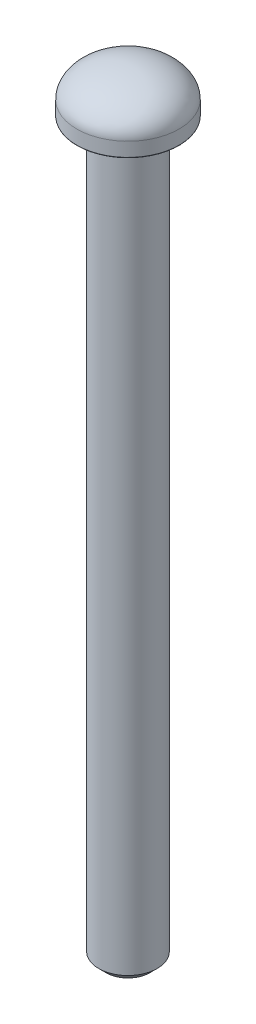
ISO-10303-21;
HEADER;
FILE_DESCRIPTION(('STEP AP214'),'2;1');
FILE_NAME('part.step','',(''),(''),'','','');
FILE_SCHEMA(('AUTOMOTIVE_DESIGN { 1 0 10303 214 1 1 1 1 }'));
ENDSEC;
DATA;
#1=APPLICATION_CONTEXT('core data for automotive mechanical design processes');
#2=APPLICATION_PROTOCOL_DEFINITION('international standard','automotive_design',2000,#1);
#3=PRODUCT_CONTEXT('',#1,'mechanical');
#4=PRODUCT('Part','Part','',(#3));
#5=PRODUCT_RELATED_PRODUCT_CATEGORY('part','',(#4));
#6=PRODUCT_DEFINITION_FORMATION('','',#4);
#7=PRODUCT_DEFINITION_CONTEXT('part definition',#1,'design');
#8=PRODUCT_DEFINITION('design','',#6,#7);
#9=PRODUCT_DEFINITION_SHAPE('','',#8);
#10=(LENGTH_UNIT() NAMED_UNIT(*) SI_UNIT(.MILLI.,.METRE.));
#11=(NAMED_UNIT(*) PLANE_ANGLE_UNIT() SI_UNIT($,.RADIAN.));
#12=(NAMED_UNIT(*) SI_UNIT($,.STERADIAN.) SOLID_ANGLE_UNIT());
#13=UNCERTAINTY_MEASURE_WITH_UNIT(LENGTH_MEASURE(1.E-05),#10,'distance_accuracy_value','');
#14=(GEOMETRIC_REPRESENTATION_CONTEXT(3) GLOBAL_UNCERTAINTY_ASSIGNED_CONTEXT((#13)) GLOBAL_UNIT_ASSIGNED_CONTEXT((#10,
#11,#12)) REPRESENTATION_CONTEXT('',''));
#15=CARTESIAN_POINT('',(0.,0.,0.));
#16=DIRECTION('',(0.,0.,1.));
#17=DIRECTION('',(1.,0.,0.));
#18=AXIS2_PLACEMENT_3D('',#15,#16,#17);
#19=CARTESIAN_POINT('',(0.,100.,0.));
#20=DIRECTION('',(0.,-1.,0.));
#21=DIRECTION('',(0.,0.,-1.));
#22=AXIS2_PLACEMENT_3D('',#19,#20,#21);
#23=CYLINDRICAL_SURFACE('',#22,4.);
#24=CARTESIAN_POINT('',(0.,1.,0.));
#25=DIRECTION('',(0.,1.,0.));
#26=DIRECTION('',(0.,0.,1.));
#27=AXIS2_PLACEMENT_3D('',#24,#25,#26);
#28=CIRCLE('',#27,4.);
#29=CARTESIAN_POINT('',(0.,1.,4.));
#30=VERTEX_POINT('',#29);
#31=EDGE_CURVE('E39',#30,#30,#28,.T.);
#32=ORIENTED_EDGE('',*,*,#31,.T.);
#33=EDGE_LOOP('',(#32));
#34=FACE_BOUND('',#33,.T.);
#35=CARTESIAN_POINT('',(0.,99.9,0.));
#36=DIRECTION('',(0.,1.,0.));
#37=DIRECTION('',(0.,0.,1.));
#38=AXIS2_PLACEMENT_3D('',#35,#36,#37);
#39=CIRCLE('',#38,4.);
#40=CARTESIAN_POINT('',(0.,99.9,4.));
#41=VERTEX_POINT('',#40);
#42=EDGE_CURVE('E86',#41,#41,#39,.F.);
#43=ORIENTED_EDGE('',*,*,#42,.T.);
#44=EDGE_LOOP('',(#43));
#45=FACE_BOUND('',#44,.T.);
#46=ADVANCED_FACE('F32',(#34,#45),#23,.T.);
#47=CARTESIAN_POINT('',(0.,0.,0.));
#48=DIRECTION('',(0.,1.,0.));
#49=DIRECTION('',(0.,0.,1.));
#50=AXIS2_PLACEMENT_3D('',#47,#48,#49);
#51=PLANE('',#50);
#52=CARTESIAN_POINT('',(0.,0.,0.));
#53=DIRECTION('',(0.,1.,0.));
#54=DIRECTION('',(0.,0.,1.));
#55=AXIS2_PLACEMENT_3D('',#52,#53,#54);
#56=CIRCLE('',#55,3.);
#57=CARTESIAN_POINT('',(0.,0.,3.));
#58=VERTEX_POINT('',#57);
#59=EDGE_CURVE('E11',#58,#58,#56,.F.);
#60=ORIENTED_EDGE('',*,*,#59,.T.);
#61=EDGE_LOOP('',(#60));
#62=FACE_BOUND('',#61,.T.);
#63=ADVANCED_FACE('F76',(#62),#51,.F.);
#64=CARTESIAN_POINT('',(0.,102.,0.));
#65=DIRECTION('',(0.,-1.,0.));
#66=DIRECTION('',(0.,0.,-1.));
#67=AXIS2_PLACEMENT_3D('',#64,#65,#66);
#68=CYLINDRICAL_SURFACE('',#67,7.);
#69=CARTESIAN_POINT('',(0.,100.1,0.));
#70=DIRECTION('',(0.,1.,0.));
#71=DIRECTION('',(0.,0.,1.));
#72=AXIS2_PLACEMENT_3D('',#69,#70,#71);
#73=CIRCLE('',#72,7.);
#74=CARTESIAN_POINT('',(0.,100.1,7.));
#75=VERTEX_POINT('',#74);
#76=EDGE_CURVE('E52',#75,#75,#73,.T.);
#77=ORIENTED_EDGE('',*,*,#76,.T.);
#78=EDGE_LOOP('',(#77));
#79=FACE_BOUND('',#78,.T.);
#80=CARTESIAN_POINT('',(0.,102.,0.));
#81=DIRECTION('',(0.,1.,0.));
#82=DIRECTION('',(0.,0.,1.));
#83=AXIS2_PLACEMENT_3D('',#80,#81,#82);
#84=CIRCLE('',#83,7.);
#85=CARTESIAN_POINT('',(0.,102.,7.));
#86=VERTEX_POINT('',#85);
#87=EDGE_CURVE('E50',#86,#86,#84,.T.);
#88=ORIENTED_EDGE('',*,*,#87,.F.);
#89=EDGE_LOOP('',(#88));
#90=FACE_BOUND('',#89,.T.);
#91=ADVANCED_FACE('F46',(#79,#90),#68,.T.);
#92=CARTESIAN_POINT('',(0.,102.,0.));
#93=DIRECTION('',(1.,0.,0.));
#94=DIRECTION('',(0.,0.,1.));
#95=AXIS2_PLACEMENT_3D('',#92,#93,#94);
#96=ELLIPSE('',#95,7.,4.);
#97=TRIMMED_CURVE('',#96,(PARAMETER_VALUE(4.71238898038469)),
(PARAMETER_VALUE(7.85398163397448)),.T.,.PARAMETER.);
#98=CARTESIAN_POINT('',(0.,98.,0.));
#99=DIRECTION('',(0.,1.,0.));
#100=AXIS1_PLACEMENT('',#98,#99);
#101=SURFACE_OF_REVOLUTION('',#97,#100);
#102=CARTESIAN_POINT('',(0.,106.,0.));
#103=VERTEX_POINT('',#102);
#104=VERTEX_LOOP('',#103);
#105=FACE_BOUND('',#104,.T.);
#106=ORIENTED_EDGE('',*,*,#87,.T.);
#107=EDGE_LOOP('',(#106));
#108=FACE_BOUND('',#107,.T.);
#109=ADVANCED_FACE('F42',(#105,#108),#101,.F.);
#110=CARTESIAN_POINT('',(0.,100.,0.));
#111=DIRECTION('',(0.,1.,0.));
#112=DIRECTION('',(0.,0.,1.));
#113=AXIS2_PLACEMENT_3D('',#110,#111,#112);
#114=PLANE('',#113);
#115=CARTESIAN_POINT('',(0.,100.,0.));
#116=DIRECTION('',(0.,1.,0.));
#117=DIRECTION('',(0.,0.,1.));
#118=AXIS2_PLACEMENT_3D('',#115,#116,#117);
#119=CIRCLE('',#118,6.9);
#120=CARTESIAN_POINT('',(0.,100.,6.9));
#121=VERTEX_POINT('',#120);
#122=EDGE_CURVE('E87',#121,#121,#119,.F.);
#123=ORIENTED_EDGE('',*,*,#122,.T.);
#124=EDGE_LOOP('',(#123));
#125=FACE_BOUND('',#124,.T.);
#126=CARTESIAN_POINT('',(0.,100.,0.));
#127=DIRECTION('',(0.,1.,0.));
#128=DIRECTION('',(0.,0.,1.));
#129=AXIS2_PLACEMENT_3D('',#126,#127,#128);
#130=CIRCLE('',#129,4.1);
#131=CARTESIAN_POINT('',(0.,100.,4.1));
#132=VERTEX_POINT('',#131);
#133=EDGE_CURVE('E55',#132,#132,#130,.T.);
#134=ORIENTED_EDGE('',*,*,#133,.T.);
#135=EDGE_LOOP('',(#134));
#136=FACE_BOUND('',#135,.T.);
#137=ADVANCED_FACE('F45',(#125,#136),#114,.F.);
#138=CARTESIAN_POINT('',(0.,100.1,0.));
#139=DIRECTION('',(0.,1.,0.));
#140=DIRECTION('',(0.,0.,1.));
#141=AXIS2_PLACEMENT_3D('',#138,#139,#140);
#142=TOROIDAL_SURFACE('',#141,6.9,0.1);
#143=ORIENTED_EDGE('',*,*,#122,.F.);
#144=EDGE_LOOP('',(#143));
#145=FACE_BOUND('',#144,.T.);
#146=ORIENTED_EDGE('',*,*,#76,.F.);
#147=EDGE_LOOP('',(#146));
#148=FACE_BOUND('',#147,.T.);
#149=ADVANCED_FACE('F63',(#145,#148),#142,.T.);
#150=CARTESIAN_POINT('',(0.,99.9,0.));
#151=DIRECTION('',(0.,1.,0.));
#152=DIRECTION('',(0.,0.,1.));
#153=AXIS2_PLACEMENT_3D('',#150,#151,#152);
#154=TOROIDAL_SURFACE('',#153,4.1,0.1);
#155=ORIENTED_EDGE('',*,*,#42,.F.);
#156=EDGE_LOOP('',(#155));
#157=FACE_BOUND('',#156,.T.);
#158=ORIENTED_EDGE('',*,*,#133,.F.);
#159=EDGE_LOOP('',(#158));
#160=FACE_BOUND('',#159,.T.);
#161=ADVANCED_FACE('F65',(#157,#160),#154,.F.);
#162=CARTESIAN_POINT('',(0.,1.,0.));
#163=DIRECTION('',(0.,1.,0.));
#164=DIRECTION('',(0.,0.,1.));
#165=AXIS2_PLACEMENT_3D('',#162,#163,#164);
#166=CONICAL_SURFACE('',#165,4.,0.785398163397447);
#167=ORIENTED_EDGE('',*,*,#59,.F.);
#168=EDGE_LOOP('',(#167));
#169=FACE_BOUND('',#168,.T.);
#170=ORIENTED_EDGE('',*,*,#31,.F.);
#171=EDGE_LOOP('',(#170));
#172=FACE_BOUND('',#171,.T.);
#173=ADVANCED_FACE('F34',(#169,#172),#166,.T.);
#174=CLOSED_SHELL('',(#46,#63,#91,#109,#137,#149,#161,#173));
#175=MANIFOLD_SOLID_BREP('B2',#174);
#176=ADVANCED_BREP_SHAPE_REPRESENTATION('',(#18,#175),#14);
#177=SHAPE_DEFINITION_REPRESENTATION(#9,#176);
ENDSEC;
END-ISO-10303-21;
